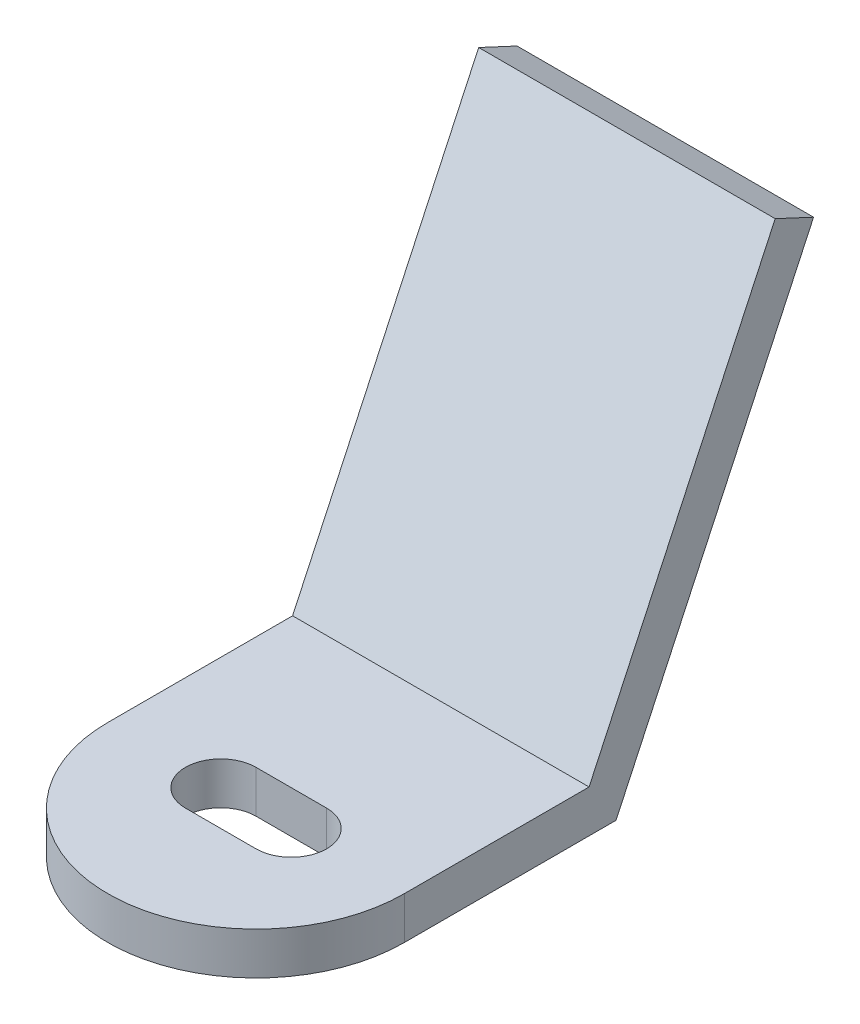
ISO-10303-21;
HEADER;
FILE_DESCRIPTION(('STEP AP214'),'2;1');
FILE_NAME('part.step','',(''),(''),'','','');
FILE_SCHEMA(('AUTOMOTIVE_DESIGN { 1 0 10303 214 1 1 1 1 }'));
ENDSEC;
DATA;
#1=APPLICATION_CONTEXT('core data for automotive mechanical design processes');
#2=APPLICATION_PROTOCOL_DEFINITION('international standard','automotive_design',2000,#1);
#3=PRODUCT_CONTEXT('',#1,'mechanical');
#4=PRODUCT('Part','Part','',(#3));
#5=PRODUCT_RELATED_PRODUCT_CATEGORY('part','',(#4));
#6=PRODUCT_DEFINITION_FORMATION('','',#4);
#7=PRODUCT_DEFINITION_CONTEXT('part definition',#1,'design');
#8=PRODUCT_DEFINITION('design','',#6,#7);
#9=PRODUCT_DEFINITION_SHAPE('','',#8);
#10=(LENGTH_UNIT() NAMED_UNIT(*) SI_UNIT(.MILLI.,.METRE.));
#11=(NAMED_UNIT(*) PLANE_ANGLE_UNIT() SI_UNIT($,.RADIAN.));
#12=(NAMED_UNIT(*) SI_UNIT($,.STERADIAN.) SOLID_ANGLE_UNIT());
#13=UNCERTAINTY_MEASURE_WITH_UNIT(LENGTH_MEASURE(1.E-05),#10,'distance_accuracy_value','');
#14=(GEOMETRIC_REPRESENTATION_CONTEXT(3) GLOBAL_UNCERTAINTY_ASSIGNED_CONTEXT((#13)) GLOBAL_UNIT_ASSIGNED_CONTEXT((#10,
#11,#12)) REPRESENTATION_CONTEXT('',''));
#15=CARTESIAN_POINT('',(0.,0.,0.));
#16=DIRECTION('',(0.,0.,1.));
#17=DIRECTION('',(1.,0.,0.));
#18=AXIS2_PLACEMENT_3D('',#15,#16,#17);
#19=CARTESIAN_POINT('',(0.,3.,0.));
#20=DIRECTION('',(0.,1.,0.));
#21=DIRECTION('',(0.,0.,1.));
#22=AXIS2_PLACEMENT_3D('',#19,#20,#21);
#23=PLANE('',#22);
#24=DIRECTION('',(1.,0.,0.));
#25=VECTOR('',#24,1.);
#26=CARTESIAN_POINT('',(0.,3.,-13.0887892175775));
#27=LINE('',#26,#25);
#28=CARTESIAN_POINT('',(-10.5,3.,-13.0887892175775));
#29=VERTEX_POINT('',#28);
#30=CARTESIAN_POINT('',(10.5,3.,-13.0887892175775));
#31=VERTEX_POINT('',#30);
#32=EDGE_CURVE('E204',#29,#31,#27,.T.);
#33=ORIENTED_EDGE('',*,*,#32,.F.);
#34=DIRECTION('',(0.,0.,1.));
#35=VECTOR('',#34,1.);
#36=CARTESIAN_POINT('',(-10.5,3.,0.));
#37=LINE('',#36,#35);
#38=CARTESIAN_POINT('',(-10.5,3.,0.));
#39=VERTEX_POINT('',#38);
#40=EDGE_CURVE('E152',#29,#39,#37,.T.);
#41=ORIENTED_EDGE('',*,*,#40,.T.);
#42=CARTESIAN_POINT('',(0.,3.,0.));
#43=DIRECTION('',(0.,1.,0.));
#44=DIRECTION('',(0.,0.,1.));
#45=AXIS2_PLACEMENT_3D('',#42,#43,#44);
#46=CIRCLE('',#45,10.5);
#47=CARTESIAN_POINT('',(10.5,3.,0.));
#48=VERTEX_POINT('',#47);
#49=EDGE_CURVE('E147',#39,#48,#46,.T.);
#50=ORIENTED_EDGE('',*,*,#49,.T.);
#51=DIRECTION('',(0.,0.,-1.));
#52=VECTOR('',#51,1.);
#53=CARTESIAN_POINT('',(10.5,3.,-15.));
#54=LINE('',#53,#52);
#55=EDGE_CURVE('E157',#48,#31,#54,.T.);
#56=ORIENTED_EDGE('',*,*,#55,.T.);
#57=EDGE_LOOP('',(#33,#41,#50,#56));
#58=FACE_BOUND('',#57,.T.);
#59=DIRECTION('',(1.,0.,0.));
#60=VECTOR('',#59,1.);
#61=CARTESIAN_POINT('',(-2.5,3.,2.5));
#62=LINE('',#61,#60);
#63=CARTESIAN_POINT('',(-2.5,3.,2.5));
#64=VERTEX_POINT('',#63);
#65=CARTESIAN_POINT('',(2.5,3.,2.5));
#66=VERTEX_POINT('',#65);
#67=EDGE_CURVE('E216',#64,#66,#62,.T.);
#68=ORIENTED_EDGE('',*,*,#67,.F.);
#69=CARTESIAN_POINT('',(-2.5,3.,0.));
#70=DIRECTION('',(0.,1.,0.));
#71=DIRECTION('',(0.,0.,1.));
#72=AXIS2_PLACEMENT_3D('',#69,#70,#71);
#73=CIRCLE('',#72,2.5);
#74=CARTESIAN_POINT('',(-2.5,3.,-2.5));
#75=VERTEX_POINT('',#74);
#76=EDGE_CURVE('E213',#75,#64,#73,.T.);
#77=ORIENTED_EDGE('',*,*,#76,.F.);
#78=DIRECTION('',(-1.,0.,0.));
#79=VECTOR('',#78,1.);
#80=CARTESIAN_POINT('',(-2.5,3.,-2.5));
#81=LINE('',#80,#79);
#82=CARTESIAN_POINT('',(2.5,3.,-2.5));
#83=VERTEX_POINT('',#82);
#84=EDGE_CURVE('E223',#83,#75,#81,.T.);
#85=ORIENTED_EDGE('',*,*,#84,.F.);
#86=CARTESIAN_POINT('',(2.5,3.,0.));
#87=DIRECTION('',(0.,1.,0.));
#88=DIRECTION('',(0.,0.,1.));
#89=AXIS2_PLACEMENT_3D('',#86,#87,#88);
#90=CIRCLE('',#89,2.5);
#91=EDGE_CURVE('E220',#66,#83,#90,.T.);
#92=ORIENTED_EDGE('',*,*,#91,.F.);
#93=EDGE_LOOP('',(#68,#77,#85,#92));
#94=FACE_BOUND('',#93,.T.);
#95=ADVANCED_FACE('F37',(#58,#94),#23,.T.);
#96=CARTESIAN_POINT('',(0.,0.,0.));
#97=DIRECTION('',(0.,1.,0.));
#98=DIRECTION('',(0.,0.,1.));
#99=AXIS2_PLACEMENT_3D('',#96,#97,#98);
#100=PLANE('',#99);
#101=CARTESIAN_POINT('',(0.,0.,0.));
#102=DIRECTION('',(0.,1.,0.));
#103=DIRECTION('',(0.,0.,1.));
#104=AXIS2_PLACEMENT_3D('',#101,#102,#103);
#105=CIRCLE('',#104,10.5);
#106=CARTESIAN_POINT('',(-10.5,0.,0.));
#107=VERTEX_POINT('',#106);
#108=CARTESIAN_POINT('',(10.5,0.,0.));
#109=VERTEX_POINT('',#108);
#110=EDGE_CURVE('E128',#107,#109,#105,.T.);
#111=ORIENTED_EDGE('',*,*,#110,.F.);
#112=DIRECTION('',(0.,0.,1.));
#113=VECTOR('',#112,1.);
#114=CARTESIAN_POINT('',(-10.5,0.,0.));
#115=LINE('',#114,#113);
#116=CARTESIAN_POINT('',(-10.5,0.,-15.));
#117=VERTEX_POINT('',#116);
#118=EDGE_CURVE('E143',#117,#107,#115,.T.);
#119=ORIENTED_EDGE('',*,*,#118,.F.);
#120=DIRECTION('',(-1.,0.,0.));
#121=VECTOR('',#120,1.);
#122=CARTESIAN_POINT('',(-10.5,0.,-15.));
#123=LINE('',#122,#121);
#124=CARTESIAN_POINT('',(10.5,0.,-15.));
#125=VERTEX_POINT('',#124);
#126=EDGE_CURVE('E127',#125,#117,#123,.T.);
#127=ORIENTED_EDGE('',*,*,#126,.F.);
#128=DIRECTION('',(0.,0.,-1.));
#129=VECTOR('',#128,1.);
#130=CARTESIAN_POINT('',(10.5,0.,-15.));
#131=LINE('',#130,#129);
#132=EDGE_CURVE('E116',#109,#125,#131,.T.);
#133=ORIENTED_EDGE('',*,*,#132,.F.);
#134=EDGE_LOOP('',(#111,#119,#127,#133));
#135=FACE_BOUND('',#134,.T.);
#136=CARTESIAN_POINT('',(-2.5,0.,0.));
#137=DIRECTION('',(0.,1.,0.));
#138=DIRECTION('',(0.,0.,1.));
#139=AXIS2_PLACEMENT_3D('',#136,#137,#138);
#140=CIRCLE('',#139,2.5);
#141=CARTESIAN_POINT('',(-2.5,0.,-2.5));
#142=VERTEX_POINT('',#141);
#143=CARTESIAN_POINT('',(-2.5,0.,2.5));
#144=VERTEX_POINT('',#143);
#145=EDGE_CURVE('E61',#142,#144,#140,.T.);
#146=ORIENTED_EDGE('',*,*,#145,.T.);
#147=DIRECTION('',(1.,0.,0.));
#148=VECTOR('',#147,1.);
#149=CARTESIAN_POINT('',(-2.5,0.,2.5));
#150=LINE('',#149,#148);
#151=CARTESIAN_POINT('',(2.5,0.,2.5));
#152=VERTEX_POINT('',#151);
#153=EDGE_CURVE('E229',#144,#152,#150,.T.);
#154=ORIENTED_EDGE('',*,*,#153,.T.);
#155=CARTESIAN_POINT('',(2.5,0.,0.));
#156=DIRECTION('',(0.,1.,0.));
#157=DIRECTION('',(0.,0.,1.));
#158=AXIS2_PLACEMENT_3D('',#155,#156,#157);
#159=CIRCLE('',#158,2.5);
#160=CARTESIAN_POINT('',(2.5,0.,-2.5));
#161=VERTEX_POINT('',#160);
#162=EDGE_CURVE('E233',#152,#161,#159,.T.);
#163=ORIENTED_EDGE('',*,*,#162,.T.);
#164=DIRECTION('',(-1.,0.,0.));
#165=VECTOR('',#164,1.);
#166=CARTESIAN_POINT('',(-2.5,0.,-2.5));
#167=LINE('',#166,#165);
#168=EDGE_CURVE('E217',#161,#142,#167,.T.);
#169=ORIENTED_EDGE('',*,*,#168,.T.);
#170=EDGE_LOOP('',(#146,#154,#163,#169));
#171=FACE_BOUND('',#170,.T.);
#172=ADVANCED_FACE('F141',(#135,#171),#100,.F.);
#173=CARTESIAN_POINT('',(0.,3.,0.));
#174=DIRECTION('',(0.,-1.,0.));
#175=DIRECTION('',(0.,0.,-1.));
#176=AXIS2_PLACEMENT_3D('',#173,#174,#175);
#177=CYLINDRICAL_SURFACE('',#176,10.5);
#178=ORIENTED_EDGE('',*,*,#110,.T.);
#179=DIRECTION('',(0.,-1.,0.));
#180=VECTOR('',#179,1.);
#181=CARTESIAN_POINT('',(10.5,3.,0.));
#182=LINE('',#181,#180);
#183=EDGE_CURVE('E11',#48,#109,#182,.T.);
#184=ORIENTED_EDGE('',*,*,#183,.F.);
#185=ORIENTED_EDGE('',*,*,#49,.F.);
#186=DIRECTION('',(0.,-1.,0.));
#187=VECTOR('',#186,1.);
#188=CARTESIAN_POINT('',(-10.5,3.,0.));
#189=LINE('',#188,#187);
#190=EDGE_CURVE('E46',#39,#107,#189,.T.);
#191=ORIENTED_EDGE('',*,*,#190,.T.);
#192=EDGE_LOOP('',(#178,#184,#185,#191));
#193=FACE_BOUND('',#192,.T.);
#194=ADVANCED_FACE('F39',(#193),#177,.T.);
#195=CARTESIAN_POINT('',(10.5,3.,-15.));
#196=DIRECTION('',(-1.,0.,0.));
#197=DIRECTION('',(0.,0.,1.));
#198=AXIS2_PLACEMENT_3D('',#195,#196,#197);
#199=PLANE('',#198);
#200=ORIENTED_EDGE('',*,*,#132,.T.);
#201=DIRECTION('',(0.,0.906307787036651,-0.422618261740697));
#202=VECTOR('',#201,1.);
#203=CARTESIAN_POINT('',(10.5,0.,-15.));
#204=LINE('',#203,#202);
#205=CARTESIAN_POINT('',(10.5,30.,-28.9892297446499));
#206=VERTEX_POINT('',#205);
#207=EDGE_CURVE('E120',#125,#206,#204,.T.);
#208=ORIENTED_EDGE('',*,*,#207,.T.);
#209=DIRECTION('',(0.,0.422618261740698,0.906307787036651));
#210=VECTOR('',#209,1.);
#211=CARTESIAN_POINT('',(10.5,30.,-28.9892297446499));
#212=LINE('',#211,#210);
#213=CARTESIAN_POINT('',(10.5,31.2678547852221,-26.2703063835399));
#214=VERTEX_POINT('',#213);
#215=EDGE_CURVE('E138',#206,#214,#212,.T.);
#216=ORIENTED_EDGE('',*,*,#215,.T.);
#217=DIRECTION('',(0.,-0.906307787036651,0.422618261740697));
#218=VECTOR('',#217,1.);
#219=CARTESIAN_POINT('',(10.5,31.2678547852221,-26.2703063835399));
#220=LINE('',#219,#218);
#221=EDGE_CURVE('E275',#214,#31,#220,.T.);
#222=ORIENTED_EDGE('',*,*,#221,.T.);
#223=ORIENTED_EDGE('',*,*,#55,.F.);
#224=ORIENTED_EDGE('',*,*,#183,.T.);
#225=EDGE_LOOP('',(#200,#208,#216,#222,#223,#224));
#226=FACE_BOUND('',#225,.T.);
#227=ADVANCED_FACE('F118',(#226),#199,.F.);
#228=CARTESIAN_POINT('',(-10.5,3.,0.));
#229=DIRECTION('',(1.,0.,0.));
#230=DIRECTION('',(0.,0.,-1.));
#231=AXIS2_PLACEMENT_3D('',#228,#229,#230);
#232=PLANE('',#231);
#233=ORIENTED_EDGE('',*,*,#40,.F.);
#234=DIRECTION('',(0.,0.906307787036651,-0.422618261740697));
#235=VECTOR('',#234,1.);
#236=CARTESIAN_POINT('',(-10.5,31.2678547852221,-26.2703063835399));
#237=LINE('',#236,#235);
#238=CARTESIAN_POINT('',(-10.5,31.2678547852221,-26.2703063835399));
#239=VERTEX_POINT('',#238);
#240=EDGE_CURVE('E199',#29,#239,#237,.T.);
#241=ORIENTED_EDGE('',*,*,#240,.T.);
#242=DIRECTION('',(0.,-0.422618261740698,-0.906307787036651));
#243=VECTOR('',#242,1.);
#244=CARTESIAN_POINT('',(-10.5,30.,-28.9892297446499));
#245=LINE('',#244,#243);
#246=CARTESIAN_POINT('',(-10.5,30.,-28.9892297446499));
#247=VERTEX_POINT('',#246);
#248=EDGE_CURVE('E202',#239,#247,#245,.T.);
#249=ORIENTED_EDGE('',*,*,#248,.T.);
#250=DIRECTION('',(0.,-0.906307787036651,0.422618261740697));
#251=VECTOR('',#250,1.);
#252=CARTESIAN_POINT('',(-10.5,0.,-15.));
#253=LINE('',#252,#251);
#254=EDGE_CURVE('E201',#247,#117,#253,.T.);
#255=ORIENTED_EDGE('',*,*,#254,.T.);
#256=ORIENTED_EDGE('',*,*,#118,.T.);
#257=ORIENTED_EDGE('',*,*,#190,.F.);
#258=EDGE_LOOP('',(#233,#241,#249,#255,#256,#257));
#259=FACE_BOUND('',#258,.T.);
#260=ADVANCED_FACE('F183',(#259),#232,.F.);
#261=CARTESIAN_POINT('',(-2.5,3.,0.));
#262=DIRECTION('',(0.,-1.,0.));
#263=DIRECTION('',(0.,0.,-1.));
#264=AXIS2_PLACEMENT_3D('',#261,#262,#263);
#265=CYLINDRICAL_SURFACE('',#264,2.5);
#266=ORIENTED_EDGE('',*,*,#145,.F.);
#267=DIRECTION('',(0.,-1.,0.));
#268=VECTOR('',#267,1.);
#269=CARTESIAN_POINT('',(-2.5,3.,-2.5));
#270=LINE('',#269,#268);
#271=EDGE_CURVE('E226',#75,#142,#270,.T.);
#272=ORIENTED_EDGE('',*,*,#271,.F.);
#273=ORIENTED_EDGE('',*,*,#76,.T.);
#274=DIRECTION('',(0.,-1.,0.));
#275=VECTOR('',#274,1.);
#276=CARTESIAN_POINT('',(-2.5,3.,2.5));
#277=LINE('',#276,#275);
#278=EDGE_CURVE('E168',#64,#144,#277,.T.);
#279=ORIENTED_EDGE('',*,*,#278,.T.);
#280=EDGE_LOOP('',(#266,#272,#273,#279));
#281=FACE_BOUND('',#280,.T.);
#282=ADVANCED_FACE('F190',(#281),#265,.F.);
#283=CARTESIAN_POINT('',(-2.5,3.,2.5));
#284=DIRECTION('',(0.,0.,-1.));
#285=DIRECTION('',(-1.,0.,0.));
#286=AXIS2_PLACEMENT_3D('',#283,#284,#285);
#287=PLANE('',#286);
#288=ORIENTED_EDGE('',*,*,#153,.F.);
#289=ORIENTED_EDGE('',*,*,#278,.F.);
#290=ORIENTED_EDGE('',*,*,#67,.T.);
#291=DIRECTION('',(0.,-1.,0.));
#292=VECTOR('',#291,1.);
#293=CARTESIAN_POINT('',(2.5,3.,2.5));
#294=LINE('',#293,#292);
#295=EDGE_CURVE('E170',#66,#152,#294,.T.);
#296=ORIENTED_EDGE('',*,*,#295,.T.);
#297=EDGE_LOOP('',(#288,#289,#290,#296));
#298=FACE_BOUND('',#297,.T.);
#299=ADVANCED_FACE('F198',(#298),#287,.T.);
#300=CARTESIAN_POINT('',(2.5,3.,0.));
#301=DIRECTION('',(0.,-1.,0.));
#302=DIRECTION('',(0.,0.,-1.));
#303=AXIS2_PLACEMENT_3D('',#300,#301,#302);
#304=CYLINDRICAL_SURFACE('',#303,2.5);
#305=ORIENTED_EDGE('',*,*,#162,.F.);
#306=ORIENTED_EDGE('',*,*,#295,.F.);
#307=ORIENTED_EDGE('',*,*,#91,.T.);
#308=DIRECTION('',(0.,-1.,0.));
#309=VECTOR('',#308,1.);
#310=CARTESIAN_POINT('',(2.5,3.,-2.5));
#311=LINE('',#310,#309);
#312=EDGE_CURVE('E53',#83,#161,#311,.T.);
#313=ORIENTED_EDGE('',*,*,#312,.T.);
#314=EDGE_LOOP('',(#305,#306,#307,#313));
#315=FACE_BOUND('',#314,.T.);
#316=ADVANCED_FACE('F244',(#315),#304,.F.);
#317=CARTESIAN_POINT('',(-2.5,3.,-2.5));
#318=DIRECTION('',(0.,0.,1.));
#319=DIRECTION('',(1.,0.,0.));
#320=AXIS2_PLACEMENT_3D('',#317,#318,#319);
#321=PLANE('',#320);
#322=ORIENTED_EDGE('',*,*,#168,.F.);
#323=ORIENTED_EDGE('',*,*,#312,.F.);
#324=ORIENTED_EDGE('',*,*,#84,.T.);
#325=ORIENTED_EDGE('',*,*,#271,.T.);
#326=EDGE_LOOP('',(#322,#323,#324,#325));
#327=FACE_BOUND('',#326,.T.);
#328=ADVANCED_FACE('F248',(#327),#321,.T.);
#329=CARTESIAN_POINT('',(-46.2343912838607,31.2678547852221,-26.2703063835399));
#330=DIRECTION('',(0.,0.422618261740697,0.906307787036651));
#331=DIRECTION('',(0.,-0.906307787036651,0.422618261740697));
#332=AXIS2_PLACEMENT_3D('',#329,#330,#331);
#333=PLANE('',#332);
#334=ORIENTED_EDGE('',*,*,#240,.F.);
#335=ORIENTED_EDGE('',*,*,#32,.T.);
#336=ORIENTED_EDGE('',*,*,#221,.F.);
#337=DIRECTION('',(1.,0.,0.));
#338=VECTOR('',#337,1.);
#339=CARTESIAN_POINT('',(-46.2343912838607,31.2678547852221,-26.2703063835399));
#340=LINE('',#339,#338);
#341=EDGE_CURVE('E274',#239,#214,#340,.T.);
#342=ORIENTED_EDGE('',*,*,#341,.F.);
#343=EDGE_LOOP('',(#334,#335,#336,#342));
#344=FACE_BOUND('',#343,.T.);
#345=ADVANCED_FACE('F260',(#344),#333,.T.);
#346=CARTESIAN_POINT('',(-46.2343912838607,30.,-28.9892297446499));
#347=DIRECTION('',(0.,0.90630778703665,-0.422618261740698));
#348=DIRECTION('',(0.,0.422618261740698,0.906307787036651));
#349=AXIS2_PLACEMENT_3D('',#346,#347,#348);
#350=PLANE('',#349);
#351=ORIENTED_EDGE('',*,*,#248,.F.);
#352=ORIENTED_EDGE('',*,*,#341,.T.);
#353=ORIENTED_EDGE('',*,*,#215,.F.);
#354=DIRECTION('',(1.,0.,0.));
#355=VECTOR('',#354,1.);
#356=CARTESIAN_POINT('',(-46.2343912838607,30.,-28.9892297446499));
#357=LINE('',#356,#355);
#358=EDGE_CURVE('E135',#247,#206,#357,.T.);
#359=ORIENTED_EDGE('',*,*,#358,.F.);
#360=EDGE_LOOP('',(#351,#352,#353,#359));
#361=FACE_BOUND('',#360,.T.);
#362=ADVANCED_FACE('F263',(#361),#350,.T.);
#363=CARTESIAN_POINT('',(-46.2343912838607,0.,-15.));
#364=DIRECTION('',(0.,-0.422618261740697,-0.906307787036651));
#365=DIRECTION('',(0.,0.906307787036651,-0.422618261740697));
#366=AXIS2_PLACEMENT_3D('',#363,#364,#365);
#367=PLANE('',#366);
#368=ORIENTED_EDGE('',*,*,#254,.F.);
#369=ORIENTED_EDGE('',*,*,#358,.T.);
#370=ORIENTED_EDGE('',*,*,#207,.F.);
#371=ORIENTED_EDGE('',*,*,#126,.T.);
#372=EDGE_LOOP('',(#368,#369,#370,#371));
#373=FACE_BOUND('',#372,.T.);
#374=ADVANCED_FACE('F132',(#373),#367,.T.);
#375=CLOSED_SHELL('',(#95,#172,#194,#227,#260,#282,#299,#316,#328,#345,#362,#374));
#376=MANIFOLD_SOLID_BREP('B2',#375);
#377=ADVANCED_BREP_SHAPE_REPRESENTATION('',(#18,#376),#14);
#378=SHAPE_DEFINITION_REPRESENTATION(#9,#377);
ENDSEC;
END-ISO-10303-21;
